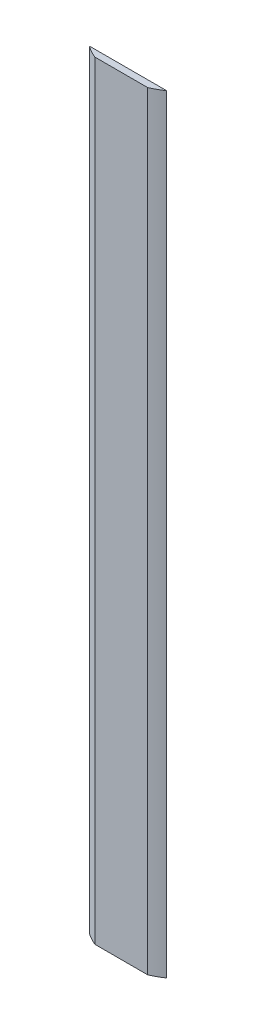
ISO-10303-21;
HEADER;
FILE_DESCRIPTION(('STEP AP214'),'2;1');
FILE_NAME('part.step','',(''),(''),'','','');
FILE_SCHEMA(('AUTOMOTIVE_DESIGN { 1 0 10303 214 1 1 1 1 }'));
ENDSEC;
DATA;
#1=APPLICATION_CONTEXT('core data for automotive mechanical design processes');
#2=APPLICATION_PROTOCOL_DEFINITION('international standard','automotive_design',2000,#1);
#3=PRODUCT_CONTEXT('',#1,'mechanical');
#4=PRODUCT('Part','Part','',(#3));
#5=PRODUCT_RELATED_PRODUCT_CATEGORY('part','',(#4));
#6=PRODUCT_DEFINITION_FORMATION('','',#4);
#7=PRODUCT_DEFINITION_CONTEXT('part definition',#1,'design');
#8=PRODUCT_DEFINITION('design','',#6,#7);
#9=PRODUCT_DEFINITION_SHAPE('','',#8);
#10=(LENGTH_UNIT() NAMED_UNIT(*) SI_UNIT(.MILLI.,.METRE.));
#11=(NAMED_UNIT(*) PLANE_ANGLE_UNIT() SI_UNIT($,.RADIAN.));
#12=(NAMED_UNIT(*) SI_UNIT($,.STERADIAN.) SOLID_ANGLE_UNIT());
#13=UNCERTAINTY_MEASURE_WITH_UNIT(LENGTH_MEASURE(1.E-05),#10,'distance_accuracy_value','');
#14=(GEOMETRIC_REPRESENTATION_CONTEXT(3) GLOBAL_UNCERTAINTY_ASSIGNED_CONTEXT((#13)) GLOBAL_UNIT_ASSIGNED_CONTEXT((#10,
#11,#12)) REPRESENTATION_CONTEXT('',''));
#15=CARTESIAN_POINT('',(0.,0.,0.));
#16=DIRECTION('',(0.,0.,1.));
#17=DIRECTION('',(1.,0.,0.));
#18=AXIS2_PLACEMENT_3D('',#15,#16,#17);
#19=CARTESIAN_POINT('',(0.,539.75,0.));
#20=DIRECTION('',(0.,-1.,0.));
#21=DIRECTION('',(0.,0.,-1.));
#22=AXIS2_PLACEMENT_3D('',#19,#20,#21);
#23=CYLINDRICAL_SURFACE('',#22,47.6885);
#24=CARTESIAN_POINT('',(0.,0.,0.));
#25=DIRECTION('',(0.,1.,0.));
#26=DIRECTION('',(0.,0.,-1.));
#27=AXIS2_PLACEMENT_3D('',#24,#25,#26);
#28=CIRCLE('',#27,47.6885);
#29=CARTESIAN_POINT('',(-27.1970708664451,0.,39.1728524431853));
#30=VERTEX_POINT('',#29);
#31=CARTESIAN_POINT('',(-18.5439434302172,0.,43.9353524431853));
#32=VERTEX_POINT('',#31);
#33=EDGE_CURVE('E98',#30,#32,#28,.T.);
#34=ORIENTED_EDGE('',*,*,#33,.T.);
#35=DIRECTION('',(0.,-1.,0.));
#36=VECTOR('',#35,1.);
#37=CARTESIAN_POINT('',(-18.5439434302172,539.75,43.9353524431853));
#38=LINE('',#37,#36);
#39=CARTESIAN_POINT('',(-18.5439434302172,539.75,43.9353524431853));
#40=VERTEX_POINT('',#39);
#41=EDGE_CURVE('E11',#40,#32,#38,.T.);
#42=ORIENTED_EDGE('',*,*,#41,.F.);
#43=CARTESIAN_POINT('',(0.,539.75,0.));
#44=DIRECTION('',(0.,1.,0.));
#45=DIRECTION('',(0.,0.,-1.));
#46=AXIS2_PLACEMENT_3D('',#43,#44,#45);
#47=CIRCLE('',#46,47.6885);
#48=CARTESIAN_POINT('',(-27.1970708664451,539.75,39.1728524431853));
#49=VERTEX_POINT('',#48);
#50=EDGE_CURVE('E86',#49,#40,#47,.T.);
#51=ORIENTED_EDGE('',*,*,#50,.F.);
#52=DIRECTION('',(0.,-1.,0.));
#53=VECTOR('',#52,1.);
#54=CARTESIAN_POINT('',(-27.1970708664451,539.75,39.1728524431853));
#55=LINE('',#54,#53);
#56=EDGE_CURVE('E94',#49,#30,#55,.T.);
#57=ORIENTED_EDGE('',*,*,#56,.T.);
#58=EDGE_LOOP('',(#34,#42,#51,#57));
#59=FACE_BOUND('',#58,.T.);
#60=ADVANCED_FACE('F35',(#59),#23,.T.);
#61=CARTESIAN_POINT('',(-18.5439434302172,539.75,43.9353524431853));
#62=DIRECTION('',(0.,0.,-1.));
#63=DIRECTION('',(-1.,0.,0.));
#64=AXIS2_PLACEMENT_3D('',#61,#62,#63);
#65=PLANE('',#64);
#66=DIRECTION('',(1.,0.,0.));
#67=VECTOR('',#66,1.);
#68=CARTESIAN_POINT('',(-18.5439434302172,0.,43.9353524431853));
#69=LINE('',#68,#67);
#70=CARTESIAN_POINT('',(18.5439434302172,0.,43.9353524431853));
#71=VERTEX_POINT('',#70);
#72=EDGE_CURVE('E90',#32,#71,#69,.T.);
#73=ORIENTED_EDGE('',*,*,#72,.T.);
#74=DIRECTION('',(0.,-1.,0.));
#75=VECTOR('',#74,1.);
#76=CARTESIAN_POINT('',(18.5439434302172,539.75,43.9353524431853));
#77=LINE('',#76,#75);
#78=CARTESIAN_POINT('',(18.5439434302172,539.75,43.9353524431853));
#79=VERTEX_POINT('',#78);
#80=EDGE_CURVE('E43',#79,#71,#77,.T.);
#81=ORIENTED_EDGE('',*,*,#80,.F.);
#82=DIRECTION('',(1.,0.,0.));
#83=VECTOR('',#82,1.);
#84=CARTESIAN_POINT('',(-18.5439434302172,539.75,43.9353524431853));
#85=LINE('',#84,#83);
#86=EDGE_CURVE('E81',#40,#79,#85,.T.);
#87=ORIENTED_EDGE('',*,*,#86,.F.);
#88=ORIENTED_EDGE('',*,*,#41,.T.);
#89=EDGE_LOOP('',(#73,#81,#87,#88));
#90=FACE_BOUND('',#89,.T.);
#91=ADVANCED_FACE('F89',(#90),#65,.F.);
#92=CARTESIAN_POINT('',(0.,539.75,0.));
#93=DIRECTION('',(0.,-1.,0.));
#94=DIRECTION('',(0.,0.,-1.));
#95=AXIS2_PLACEMENT_3D('',#92,#93,#94);
#96=CYLINDRICAL_SURFACE('',#95,47.6885);
#97=CARTESIAN_POINT('',(0.,0.,0.));
#98=DIRECTION('',(0.,1.,0.));
#99=DIRECTION('',(0.,0.,1.));
#100=AXIS2_PLACEMENT_3D('',#97,#98,#99);
#101=CIRCLE('',#100,47.6885);
#102=CARTESIAN_POINT('',(27.1970708664451,0.,39.1728524431853));
#103=VERTEX_POINT('',#102);
#104=EDGE_CURVE('E68',#71,#103,#101,.T.);
#105=ORIENTED_EDGE('',*,*,#104,.T.);
#106=DIRECTION('',(0.,-1.,0.));
#107=VECTOR('',#106,1.);
#108=CARTESIAN_POINT('',(27.1970708664451,539.75,39.1728524431853));
#109=LINE('',#108,#107);
#110=CARTESIAN_POINT('',(27.1970708664451,539.75,39.1728524431853));
#111=VERTEX_POINT('',#110);
#112=EDGE_CURVE('E91',#111,#103,#109,.T.);
#113=ORIENTED_EDGE('',*,*,#112,.F.);
#114=CARTESIAN_POINT('',(0.,539.75,0.));
#115=DIRECTION('',(0.,1.,0.));
#116=DIRECTION('',(0.,0.,1.));
#117=AXIS2_PLACEMENT_3D('',#114,#115,#116);
#118=CIRCLE('',#117,47.6885);
#119=EDGE_CURVE('E84',#79,#111,#118,.T.);
#120=ORIENTED_EDGE('',*,*,#119,.F.);
#121=ORIENTED_EDGE('',*,*,#80,.T.);
#122=EDGE_LOOP('',(#105,#113,#120,#121));
#123=FACE_BOUND('',#122,.T.);
#124=ADVANCED_FACE('F92',(#123),#96,.T.);
#125=CARTESIAN_POINT('',(-27.1970708664451,539.75,39.1728524431853));
#126=DIRECTION('',(0.,0.,1.));
#127=DIRECTION('',(1.,0.,0.));
#128=AXIS2_PLACEMENT_3D('',#125,#126,#127);
#129=PLANE('',#128);
#130=DIRECTION('',(-1.,0.,0.));
#131=VECTOR('',#130,1.);
#132=CARTESIAN_POINT('',(-27.1970708664451,0.,39.1728524431853));
#133=LINE('',#132,#131);
#134=EDGE_CURVE('E74',#103,#30,#133,.T.);
#135=ORIENTED_EDGE('',*,*,#134,.T.);
#136=ORIENTED_EDGE('',*,*,#56,.F.);
#137=DIRECTION('',(-1.,0.,0.));
#138=VECTOR('',#137,1.);
#139=CARTESIAN_POINT('',(-27.1970708664451,539.75,39.1728524431853));
#140=LINE('',#139,#138);
#141=EDGE_CURVE('E51',#111,#49,#140,.T.);
#142=ORIENTED_EDGE('',*,*,#141,.F.);
#143=ORIENTED_EDGE('',*,*,#112,.T.);
#144=EDGE_LOOP('',(#135,#136,#142,#143));
#145=FACE_BOUND('',#144,.T.);
#146=ADVANCED_FACE('F105',(#145),#129,.F.);
#147=CARTESIAN_POINT('',(0.,539.75,0.));
#148=DIRECTION('',(0.,-1.,0.));
#149=DIRECTION('',(0.,0.,-1.));
#150=AXIS2_PLACEMENT_3D('',#147,#148,#149);
#151=PLANE('',#150);
#152=ORIENTED_EDGE('',*,*,#50,.T.);
#153=ORIENTED_EDGE('',*,*,#86,.T.);
#154=ORIENTED_EDGE('',*,*,#119,.T.);
#155=ORIENTED_EDGE('',*,*,#141,.T.);
#156=EDGE_LOOP('',(#152,#153,#154,#155));
#157=FACE_BOUND('',#156,.T.);
#158=ADVANCED_FACE('F82',(#157),#151,.F.);
#159=CARTESIAN_POINT('',(0.,0.,0.));
#160=DIRECTION('',(0.,-1.,0.));
#161=DIRECTION('',(0.,0.,-1.));
#162=AXIS2_PLACEMENT_3D('',#159,#160,#161);
#163=PLANE('',#162);
#164=ORIENTED_EDGE('',*,*,#33,.F.);
#165=ORIENTED_EDGE('',*,*,#134,.F.);
#166=ORIENTED_EDGE('',*,*,#104,.F.);
#167=ORIENTED_EDGE('',*,*,#72,.F.);
#168=EDGE_LOOP('',(#164,#165,#166,#167));
#169=FACE_BOUND('',#168,.T.);
#170=ADVANCED_FACE('F108',(#169),#163,.T.);
#171=CLOSED_SHELL('',(#60,#91,#124,#146,#158,#170));
#172=MANIFOLD_SOLID_BREP('B2',#171);
#173=ADVANCED_BREP_SHAPE_REPRESENTATION('',(#18,#172),#14);
#174=SHAPE_DEFINITION_REPRESENTATION(#9,#173);
ENDSEC;
END-ISO-10303-21;
